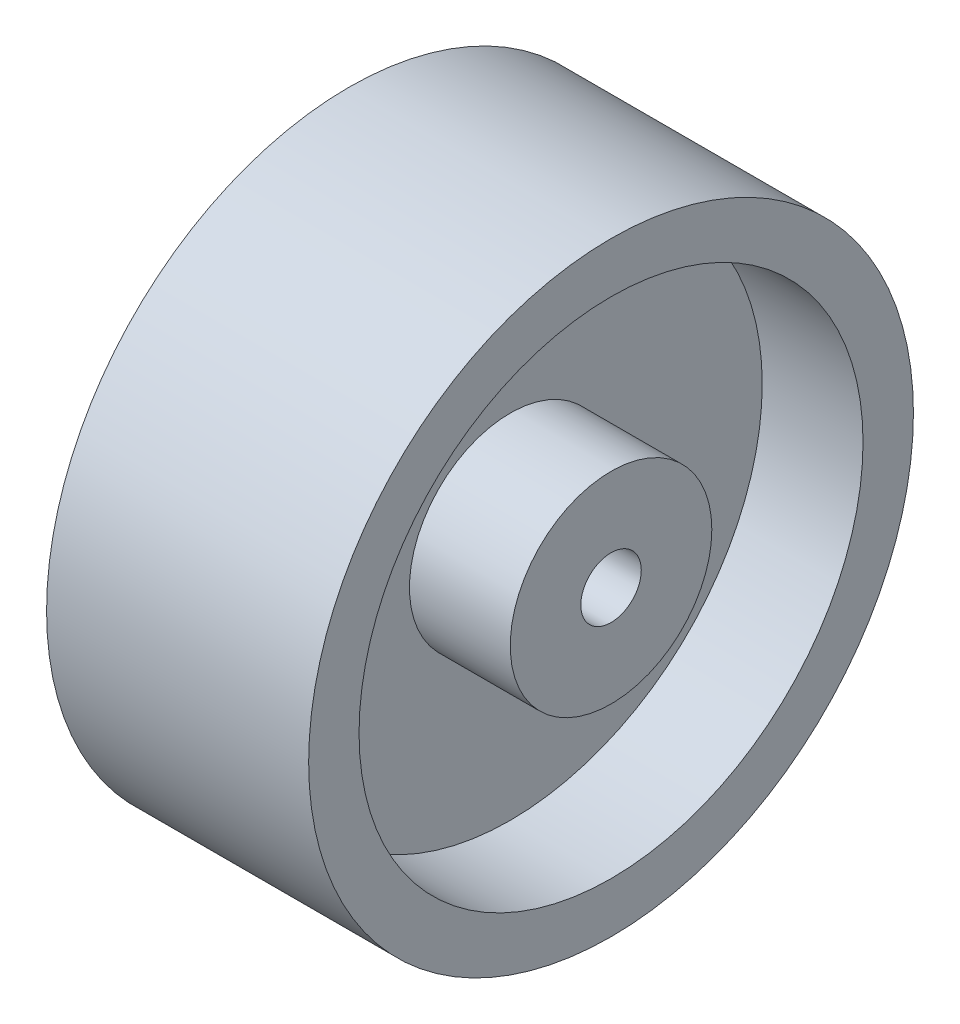
ISO-10303-21;
HEADER;
FILE_DESCRIPTION(('STEP AP214'),'2;1');
FILE_NAME('part.step','',(''),(''),'','','');
FILE_SCHEMA(('AUTOMOTIVE_DESIGN { 1 0 10303 214 1 1 1 1 }'));
ENDSEC;
DATA;
#1=APPLICATION_CONTEXT('core data for automotive mechanical design processes');
#2=APPLICATION_PROTOCOL_DEFINITION('international standard','automotive_design',2000,#1);
#3=PRODUCT_CONTEXT('',#1,'mechanical');
#4=PRODUCT('Part','Part','',(#3));
#5=PRODUCT_RELATED_PRODUCT_CATEGORY('part','',(#4));
#6=PRODUCT_DEFINITION_FORMATION('','',#4);
#7=PRODUCT_DEFINITION_CONTEXT('part definition',#1,'design');
#8=PRODUCT_DEFINITION('design','',#6,#7);
#9=PRODUCT_DEFINITION_SHAPE('','',#8);
#10=(LENGTH_UNIT() NAMED_UNIT(*) SI_UNIT(.MILLI.,.METRE.));
#11=(NAMED_UNIT(*) PLANE_ANGLE_UNIT() SI_UNIT($,.RADIAN.));
#12=(NAMED_UNIT(*) SI_UNIT($,.STERADIAN.) SOLID_ANGLE_UNIT());
#13=UNCERTAINTY_MEASURE_WITH_UNIT(LENGTH_MEASURE(1.E-05),#10,'distance_accuracy_value','');
#14=(GEOMETRIC_REPRESENTATION_CONTEXT(3) GLOBAL_UNCERTAINTY_ASSIGNED_CONTEXT((#13)) GLOBAL_UNIT_ASSIGNED_CONTEXT((#10,
#11,#12)) REPRESENTATION_CONTEXT('',''));
#15=CARTESIAN_POINT('',(0.,0.,0.));
#16=DIRECTION('',(0.,0.,1.));
#17=DIRECTION('',(1.,0.,0.));
#18=AXIS2_PLACEMENT_3D('',#15,#16,#17);
#19=CARTESIAN_POINT('',(25.,0.,0.));
#20=DIRECTION('',(-1.,0.,0.));
#21=DIRECTION('',(0.,0.,1.));
#22=AXIS2_PLACEMENT_3D('',#19,#20,#21);
#23=CYLINDRICAL_SURFACE('',#22,30.);
#24=CARTESIAN_POINT('',(25.,0.,0.));
#25=DIRECTION('',(1.,0.,0.));
#26=DIRECTION('',(0.,0.,-1.));
#27=AXIS2_PLACEMENT_3D('',#24,#25,#26);
#28=CIRCLE('',#27,30.);
#29=CARTESIAN_POINT('',(25.,0.,-30.));
#30=VERTEX_POINT('',#29);
#31=EDGE_CURVE('E12',#30,#30,#28,.T.);
#32=ORIENTED_EDGE('',*,*,#31,.F.);
#33=EDGE_LOOP('',(#32));
#34=FACE_BOUND('',#33,.T.);
#35=CARTESIAN_POINT('',(-1.,0.,0.));
#36=DIRECTION('',(-1.,0.,0.));
#37=DIRECTION('',(0.,0.,1.));
#38=AXIS2_PLACEMENT_3D('',#35,#36,#37);
#39=CIRCLE('',#38,30.);
#40=CARTESIAN_POINT('',(-1.,0.,30.));
#41=VERTEX_POINT('',#40);
#42=EDGE_CURVE('E435',#41,#41,#39,.T.);
#43=ORIENTED_EDGE('',*,*,#42,.F.);
#44=EDGE_LOOP('',(#43));
#45=FACE_BOUND('',#44,.T.);
#46=ADVANCED_FACE('F40',(#34,#45),#23,.T.);
#47=CARTESIAN_POINT('',(25.,0.,0.));
#48=DIRECTION('',(1.,0.,0.));
#49=DIRECTION('',(0.,0.,-1.));
#50=AXIS2_PLACEMENT_3D('',#47,#48,#49);
#51=PLANE('',#50);
#52=CARTESIAN_POINT('',(25.,0.,0.));
#53=DIRECTION('',(1.,0.,0.));
#54=DIRECTION('',(0.,0.,-1.));
#55=AXIS2_PLACEMENT_3D('',#52,#53,#54);
#56=CIRCLE('',#55,25.);
#57=CARTESIAN_POINT('',(25.,0.,-25.));
#58=VERTEX_POINT('',#57);
#59=EDGE_CURVE('E229',#58,#58,#56,.T.);
#60=ORIENTED_EDGE('',*,*,#59,.F.);
#61=EDGE_LOOP('',(#60));
#62=FACE_BOUND('',#61,.T.);
#63=ORIENTED_EDGE('',*,*,#31,.T.);
#64=EDGE_LOOP('',(#63));
#65=FACE_BOUND('',#64,.T.);
#66=ADVANCED_FACE('F422',(#62,#65),#51,.T.);
#67=CARTESIAN_POINT('',(15.,0.,0.));
#68=DIRECTION('',(1.,0.,0.));
#69=DIRECTION('',(0.,0.,-1.));
#70=AXIS2_PLACEMENT_3D('',#67,#68,#69);
#71=CYLINDRICAL_SURFACE('',#70,10.);
#72=CARTESIAN_POINT('',(15.,0.,0.));
#73=DIRECTION('',(1.,0.,0.));
#74=DIRECTION('',(0.,0.,-1.));
#75=AXIS2_PLACEMENT_3D('',#72,#73,#74);
#76=CIRCLE('',#75,10.);
#77=CARTESIAN_POINT('',(15.,0.,-10.));
#78=VERTEX_POINT('',#77);
#79=EDGE_CURVE('E451',#78,#78,#76,.T.);
#80=ORIENTED_EDGE('',*,*,#79,.T.);
#81=EDGE_LOOP('',(#80));
#82=FACE_BOUND('',#81,.T.);
#83=CARTESIAN_POINT('',(25.,0.,0.));
#84=DIRECTION('',(1.,0.,0.));
#85=DIRECTION('',(0.,0.,-1.));
#86=AXIS2_PLACEMENT_3D('',#83,#84,#85);
#87=CIRCLE('',#86,10.);
#88=CARTESIAN_POINT('',(25.,0.,-10.));
#89=VERTEX_POINT('',#88);
#90=EDGE_CURVE('E449',#89,#89,#87,.T.);
#91=ORIENTED_EDGE('',*,*,#90,.F.);
#92=EDGE_LOOP('',(#91));
#93=FACE_BOUND('',#92,.T.);
#94=ADVANCED_FACE('F427',(#82,#93),#71,.T.);
#95=CARTESIAN_POINT('',(15.,0.,0.));
#96=DIRECTION('',(1.,0.,0.));
#97=DIRECTION('',(0.,0.,-1.));
#98=AXIS2_PLACEMENT_3D('',#95,#96,#97);
#99=CYLINDRICAL_SURFACE('',#98,25.);
#100=CARTESIAN_POINT('',(15.,0.,0.));
#101=DIRECTION('',(1.,0.,0.));
#102=DIRECTION('',(0.,0.,-1.));
#103=AXIS2_PLACEMENT_3D('',#100,#101,#102);
#104=CIRCLE('',#103,25.);
#105=CARTESIAN_POINT('',(15.,0.,-25.));
#106=VERTEX_POINT('',#105);
#107=EDGE_CURVE('E260',#106,#106,#104,.T.);
#108=ORIENTED_EDGE('',*,*,#107,.F.);
#109=EDGE_LOOP('',(#108));
#110=FACE_BOUND('',#109,.T.);
#111=ORIENTED_EDGE('',*,*,#59,.T.);
#112=EDGE_LOOP('',(#111));
#113=FACE_BOUND('',#112,.T.);
#114=ADVANCED_FACE('F461',(#110,#113),#99,.F.);
#115=CARTESIAN_POINT('',(15.,0.,0.));
#116=DIRECTION('',(1.,0.,0.));
#117=DIRECTION('',(0.,0.,-1.));
#118=AXIS2_PLACEMENT_3D('',#115,#116,#117);
#119=PLANE('',#118);
#120=ORIENTED_EDGE('',*,*,#79,.F.);
#121=EDGE_LOOP('',(#120));
#122=FACE_BOUND('',#121,.T.);
#123=ORIENTED_EDGE('',*,*,#107,.T.);
#124=EDGE_LOOP('',(#123));
#125=FACE_BOUND('',#124,.T.);
#126=ADVANCED_FACE('F464',(#122,#125),#119,.T.);
#127=CARTESIAN_POINT('',(25.,0.,0.));
#128=DIRECTION('',(1.,0.,0.));
#129=DIRECTION('',(0.,0.,-1.));
#130=AXIS2_PLACEMENT_3D('',#127,#128,#129);
#131=CIRCLE('',#130,3.);
#132=CARTESIAN_POINT('',(25.,0.,-3.));
#133=VERTEX_POINT('',#132);
#134=EDGE_CURVE('E437',#133,#133,#131,.T.);
#135=ORIENTED_EDGE('',*,*,#134,.F.);
#136=EDGE_LOOP('',(#135));
#137=FACE_BOUND('',#136,.T.);
#138=ORIENTED_EDGE('',*,*,#90,.T.);
#139=EDGE_LOOP('',(#138));
#140=FACE_BOUND('',#139,.T.);
#141=ADVANCED_FACE('F430',(#137,#140),#51,.T.);
#142=CARTESIAN_POINT('',(15.,0.,0.));
#143=DIRECTION('',(1.,0.,0.));
#144=DIRECTION('',(0.,0.,-1.));
#145=AXIS2_PLACEMENT_3D('',#142,#143,#144);
#146=CYLINDRICAL_SURFACE('',#145,3.);
#147=CARTESIAN_POINT('',(15.,0.,0.));
#148=DIRECTION('',(1.,0.,0.));
#149=DIRECTION('',(0.,0.,-1.));
#150=AXIS2_PLACEMENT_3D('',#147,#148,#149);
#151=CIRCLE('',#150,3.);
#152=CARTESIAN_POINT('',(15.,0.,-3.));
#153=VERTEX_POINT('',#152);
#154=EDGE_CURVE('E441',#153,#153,#151,.T.);
#155=ORIENTED_EDGE('',*,*,#154,.F.);
#156=EDGE_LOOP('',(#155));
#157=FACE_BOUND('',#156,.T.);
#158=ORIENTED_EDGE('',*,*,#134,.T.);
#159=EDGE_LOOP('',(#158));
#160=FACE_BOUND('',#159,.T.);
#161=ADVANCED_FACE('F717',(#157,#160),#146,.F.);
#162=CARTESIAN_POINT('',(15.,0.,0.));
#163=DIRECTION('',(1.,0.,0.));
#164=DIRECTION('',(0.,0.,-1.));
#165=AXIS2_PLACEMENT_3D('',#162,#163,#164);
#166=PLANE('',#165);
#167=ORIENTED_EDGE('',*,*,#154,.T.);
#168=EDGE_LOOP('',(#167));
#169=FACE_BOUND('',#168,.T.);
#170=ADVANCED_FACE('F699',(#169),#166,.T.);
#171=CARTESIAN_POINT('',(-1.,0.,0.));
#172=DIRECTION('',(-1.,0.,0.));
#173=DIRECTION('',(0.,0.,1.));
#174=AXIS2_PLACEMENT_3D('',#171,#172,#173);
#175=PLANE('',#174);
#176=ORIENTED_EDGE('',*,*,#42,.T.);
#177=EDGE_LOOP('',(#176));
#178=FACE_BOUND('',#177,.T.);
#179=CARTESIAN_POINT('',(-1.,0.,0.));
#180=DIRECTION('',(-1.,0.,0.));
#181=DIRECTION('',(0.,0.,1.));
#182=AXIS2_PLACEMENT_3D('',#179,#180,#181);
#183=CIRCLE('',#182,27.0216849231796);
#184=CARTESIAN_POINT('',(-1.,0.,27.0216849231796));
#185=VERTEX_POINT('',#184);
#186=EDGE_CURVE('E438',#185,#185,#183,.T.);
#187=ORIENTED_EDGE('',*,*,#186,.F.);
#188=EDGE_LOOP('',(#187));
#189=FACE_BOUND('',#188,.T.);
#190=ADVANCED_FACE('F695',(#178,#189),#175,.T.);
#191=CARTESIAN_POINT('',(-1.,0.,0.));
#192=DIRECTION('',(1.,0.,0.));
#193=DIRECTION('',(0.,0.,-1.));
#194=AXIS2_PLACEMENT_3D('',#191,#192,#193);
#195=CYLINDRICAL_SURFACE('',#194,27.0216849231796);
#196=ORIENTED_EDGE('',*,*,#186,.T.);
#197=EDGE_LOOP('',(#196));
#198=FACE_BOUND('',#197,.T.);
#199=CARTESIAN_POINT('',(0.,0.,0.));
#200=DIRECTION('',(-1.,0.,0.));
#201=DIRECTION('',(0.,0.,1.));
#202=AXIS2_PLACEMENT_3D('',#199,#200,#201);
#203=CIRCLE('',#202,27.0216849231796);
#204=CARTESIAN_POINT('',(0.,0.,27.0216849231796));
#205=VERTEX_POINT('',#204);
#206=EDGE_CURVE('E444',#205,#205,#203,.T.);
#207=ORIENTED_EDGE('',*,*,#206,.F.);
#208=EDGE_LOOP('',(#207));
#209=FACE_BOUND('',#208,.T.);
#210=ADVANCED_FACE('F519',(#198,#209),#195,.F.);
#211=CARTESIAN_POINT('',(5.,-1.50568088735943,0.));
#212=DIRECTION('',(-1.,0.,0.));
#213=DIRECTION('',(0.,0.,-1.));
#214=AXIS2_PLACEMENT_3D('',#211,#212,#213);
#215=PLANE('',#214);
#216=CARTESIAN_POINT('',(5.,-1.50568088735943,0.));
#217=DIRECTION('',(-1.,0.,0.));
#218=DIRECTION('',(0.,0.,-1.));
#219=AXIS2_PLACEMENT_3D('',#216,#217,#218);
#220=CIRCLE('',#219,25.);
#221=CARTESIAN_POINT('',(5.,-26.1809219706033,-4.01652554875415));
#222=VERTEX_POINT('',#221);
#223=CARTESIAN_POINT('',(5.,-26.1809219706033,4.01652554875413));
#224=VERTEX_POINT('',#223);
#225=EDGE_CURVE('E275',#222,#224,#220,.T.);
#226=ORIENTED_EDGE('',*,*,#225,.T.);
#227=DIRECTION('',(0.,0.996747120219004,-0.0805926692393482));
#228=VECTOR('',#227,1.);
#229=CARTESIAN_POINT('',(5.,-1.34330142898136,2.00826277437705));
#230=LINE('',#229,#228);
#231=CARTESIAN_POINT('',(5.,-5.90449657616299,2.37706132355386));
#232=VERTEX_POINT('',#231);
#233=EDGE_CURVE('E278',#224,#232,#230,.T.);
#234=ORIENTED_EDGE('',*,*,#233,.T.);
#235=CARTESIAN_POINT('',(5.,-1.50568088735943,0.));
#236=DIRECTION('',(-1.,0.,0.));
#237=DIRECTION('',(0.,0.,-1.));
#238=AXIS2_PLACEMENT_3D('',#235,#236,#237);
#239=CIRCLE('',#238,5.);
#240=CARTESIAN_POINT('',(5.,-5.90449657616299,-2.37706132355388));
#241=VERTEX_POINT('',#240);
#242=EDGE_CURVE('E282',#241,#232,#239,.T.);
#243=ORIENTED_EDGE('',*,*,#242,.F.);
#244=DIRECTION('',(0.,0.996747120219004,0.0805926692393482));
#245=VECTOR('',#244,1.);
#246=CARTESIAN_POINT('',(5.,-1.34330142898136,-2.00826277437707));
#247=LINE('',#246,#245);
#248=EDGE_CURVE('E284',#222,#241,#247,.T.);
#249=ORIENTED_EDGE('',*,*,#248,.F.);
#250=EDGE_LOOP('',(#226,#234,#243,#249));
#251=FACE_BOUND('',#250,.T.);
#252=ADVANCED_FACE('F516',(#251),#215,.T.);
#253=CARTESIAN_POINT('',(5.,-1.12926066551957,-0.651978949222987));
#254=DIRECTION('',(-1.,0.,0.));
#255=DIRECTION('',(0.,0.866025403784436,-0.500000000000004));
#256=AXIS2_PLACEMENT_3D('',#253,#254,#255);
#257=PLANE('',#256);
#258=CARTESIAN_POINT('',(5.,-1.12926066551957,-0.651978949222987));
#259=DIRECTION('',(-1.,0.,0.));
#260=DIRECTION('',(0.,0.866025403784436,-0.500000000000004));
#261=AXIS2_PLACEMENT_3D('',#258,#259,#260);
#262=CIRCLE('',#261,25.);
#263=CARTESIAN_POINT('',(5.,-9.98846804697129,-24.0296273461947));
#264=VERTEX_POINT('',#263);
#265=CARTESIAN_POINT('',(5.,-16.9452943673119,-20.0131017974405));
#266=VERTEX_POINT('',#265);
#267=EDGE_CURVE('E303',#264,#266,#262,.T.);
#268=ORIENTED_EDGE('',*,*,#267,.T.);
#269=DIRECTION('',(0.,0.568168859029578,0.822911992638963));
#270=VECTOR('',#269,1.);
#271=CARTESIAN_POINT('',(5.,-2.78727751641568,0.492777173973722));
#272=LINE('',#271,#270);
#273=CARTESIAN_POINT('',(5.,-5.38726400247248,-3.27293442051546));
#274=VERTEX_POINT('',#273);
#275=EDGE_CURVE('E306',#266,#274,#272,.T.);
#276=ORIENTED_EDGE('',*,*,#275,.T.);
#277=CARTESIAN_POINT('',(5.,-1.12926066551957,-0.651978949222987));
#278=DIRECTION('',(-1.,0.,0.));
#279=DIRECTION('',(0.,0.866025403784436,-0.500000000000004));
#280=AXIS2_PLACEMENT_3D('',#277,#278,#279);
#281=CIRCLE('',#280,5.);
#282=CARTESIAN_POINT('',(5.,-1.27007301737026,-5.64999574406935));
#283=VERTEX_POINT('',#282);
#284=EDGE_CURVE('E310',#283,#274,#281,.T.);
#285=ORIENTED_EDGE('',*,*,#284,.F.);
#286=DIRECTION('',(0.,0.428578261189434,0.903504661878311));
#287=VECTOR('',#286,1.);
#288=CARTESIAN_POINT('',(5.,0.691135643754615,-1.51548560040336));
#289=LINE('',#288,#287);
#290=EDGE_CURVE('E312',#264,#283,#289,.T.);
#291=ORIENTED_EDGE('',*,*,#290,.F.);
#292=EDGE_LOOP('',(#268,#276,#285,#291));
#293=FACE_BOUND('',#292,.T.);
#294=ADVANCED_FACE('F481',(#293),#257,.T.);
#295=CARTESIAN_POINT('',(5.,-1.12926066551957,0.651978949222977));
#296=DIRECTION('',(-1.,0.,0.));
#297=DIRECTION('',(0.,-0.866025403784443,-0.499999999999992));
#298=AXIS2_PLACEMENT_3D('',#295,#296,#297);
#299=PLANE('',#298);
#300=CARTESIAN_POINT('',(5.,-1.12926066551957,0.651978949222977));
#301=DIRECTION('',(-1.,0.,0.));
#302=DIRECTION('',(0.,-0.866025403784443,-0.499999999999992));
#303=AXIS2_PLACEMENT_3D('',#300,#301,#302);
#304=CIRCLE('',#303,25.);
#305=CARTESIAN_POINT('',(5.,-16.9452943673116,20.0131017974407));
#306=VERTEX_POINT('',#305);
#307=CARTESIAN_POINT('',(5.,-9.98846804697097,24.0296273461948));
#308=VERTEX_POINT('',#307);
#309=EDGE_CURVE('E204',#306,#308,#304,.T.);
#310=ORIENTED_EDGE('',*,*,#309,.T.);
#311=DIRECTION('',(0.,0.428578261189421,-0.903504661878317));
#312=VECTOR('',#311,1.);
#313=CARTESIAN_POINT('',(5.,0.691135643754627,1.51548560040332));
#314=LINE('',#313,#312);
#315=CARTESIAN_POINT('',(5.,-1.27007301737019,5.64999574406934));
#316=VERTEX_POINT('',#315);
#317=EDGE_CURVE('E215',#308,#316,#314,.T.);
#318=ORIENTED_EDGE('',*,*,#317,.T.);
#319=CARTESIAN_POINT('',(5.,-1.12926066551957,0.651978949222977));
#320=DIRECTION('',(-1.,0.,0.));
#321=DIRECTION('',(0.,-0.866025403784443,-0.499999999999992));
#322=AXIS2_PLACEMENT_3D('',#319,#320,#321);
#323=CIRCLE('',#322,5.);
#324=CARTESIAN_POINT('',(5.,-5.38726400247244,3.27293442051551));
#325=VERTEX_POINT('',#324);
#326=EDGE_CURVE('E219',#325,#316,#323,.T.);
#327=ORIENTED_EDGE('',*,*,#326,.F.);
#328=DIRECTION('',(0.,0.568168859029566,-0.82291199263897));
#329=VECTOR('',#328,1.);
#330=CARTESIAN_POINT('',(5.,-2.7872775164157,-0.492777173973709));
#331=LINE('',#330,#329);
#332=EDGE_CURVE('E211',#306,#325,#331,.T.);
#333=ORIENTED_EDGE('',*,*,#332,.F.);
#334=EDGE_LOOP('',(#310,#318,#327,#333));
#335=FACE_BOUND('',#334,.T.);
#336=ADVANCED_FACE('F222',(#335),#299,.T.);
#337=CARTESIAN_POINT('',(5.,-0.376420221839854,0.651978949222974));
#338=DIRECTION('',(-1.,0.,0.));
#339=DIRECTION('',(0.,-0.866025403784433,0.50000000000001));
#340=AXIS2_PLACEMENT_3D('',#337,#338,#339);
#341=PLANE('',#340);
#342=CARTESIAN_POINT('',(5.,-0.376420221839854,0.651978949222974));
#343=DIRECTION('',(-1.,0.,0.));
#344=DIRECTION('',(0.,-0.866025403784433,0.50000000000001));
#345=AXIS2_PLACEMENT_3D('',#342,#343,#344);
#346=CIRCLE('',#345,25.);
#347=CARTESIAN_POINT('',(5.,8.48278715961203,24.0296273461946));
#348=VERTEX_POINT('',#347);
#349=CARTESIAN_POINT('',(5.,15.4396134799526,20.0131017974403));
#350=VERTEX_POINT('',#349);
#351=EDGE_CURVE('E245',#348,#350,#346,.T.);
#352=ORIENTED_EDGE('',*,*,#351,.T.);
#353=DIRECTION('',(0.,-0.568168859029584,-0.822911992638958));
#354=VECTOR('',#353,1.);
#355=CARTESIAN_POINT('',(5.,1.28159662905625,-0.492777173973746));
#356=LINE('',#355,#354);
#357=CARTESIAN_POINT('',(5.,3.88158311511307,3.27293442051541));
#358=VERTEX_POINT('',#357);
#359=EDGE_CURVE('E248',#350,#358,#356,.T.);
#360=ORIENTED_EDGE('',*,*,#359,.T.);
#361=CARTESIAN_POINT('',(5.,-0.376420221839854,0.651978949222974));
#362=DIRECTION('',(-1.,0.,0.));
#363=DIRECTION('',(0.,-0.866025403784433,0.50000000000001));
#364=AXIS2_PLACEMENT_3D('',#361,#362,#363);
#365=CIRCLE('',#364,5.);
#366=CARTESIAN_POINT('',(5.,-0.23560786998913,5.64999574406933));
#367=VERTEX_POINT('',#366);
#368=EDGE_CURVE('E252',#367,#358,#365,.T.);
#369=ORIENTED_EDGE('',*,*,#368,.F.);
#370=DIRECTION('',(0.,-0.42857826118944,-0.903504661878308));
#371=VECTOR('',#370,1.);
#372=CARTESIAN_POINT('',(5.,-2.19681653111403,1.51548560040336));
#373=LINE('',#372,#371);
#374=EDGE_CURVE('E254',#348,#367,#373,.T.);
#375=ORIENTED_EDGE('',*,*,#374,.F.);
#376=EDGE_LOOP('',(#352,#360,#369,#375));
#377=FACE_BOUND('',#376,.T.);
#378=ADVANCED_FACE('F480',(#377),#341,.T.);
#379=CARTESIAN_POINT('',(5.,-0.376420221839855,-0.651978949222984));
#380=DIRECTION('',(-1.,0.,0.));
#381=DIRECTION('',(0.,0.86602540378444,0.499999999999998));
#382=AXIS2_PLACEMENT_3D('',#379,#380,#381);
#383=PLANE('',#382);
#384=CARTESIAN_POINT('',(5.,-0.376420221839855,-0.651978949222984));
#385=DIRECTION('',(-1.,0.,0.));
#386=DIRECTION('',(0.,0.86602540378444,0.499999999999998));
#387=AXIS2_PLACEMENT_3D('',#384,#385,#386);
#388=CIRCLE('',#387,25.);
#389=CARTESIAN_POINT('',(5.,15.4396134799523,-20.0131017974406));
#390=VERTEX_POINT('',#389);
#391=CARTESIAN_POINT('',(5.,8.4827871596117,-24.0296273461947));
#392=VERTEX_POINT('',#391);
#393=EDGE_CURVE('E332',#390,#392,#388,.T.);
#394=ORIENTED_EDGE('',*,*,#393,.T.);
#395=DIRECTION('',(0.,-0.428578261189428,0.903504661878314));
#396=VECTOR('',#395,1.);
#397=CARTESIAN_POINT('',(5.,-2.19681653111405,-1.51548560040334));
#398=LINE('',#397,#396);
#399=CARTESIAN_POINT('',(5.,-0.2356078699892,-5.64999574406934));
#400=VERTEX_POINT('',#399);
#401=EDGE_CURVE('E335',#392,#400,#398,.T.);
#402=ORIENTED_EDGE('',*,*,#401,.T.);
#403=CARTESIAN_POINT('',(5.,-0.376420221839855,-0.651978949222984));
#404=DIRECTION('',(-1.,0.,0.));
#405=DIRECTION('',(0.,0.86602540378444,0.499999999999998));
#406=AXIS2_PLACEMENT_3D('',#403,#404,#405);
#407=CIRCLE('',#406,5.);
#408=CARTESIAN_POINT('',(5.,3.88158311511303,-3.27293442051548));
#409=VERTEX_POINT('',#408);
#410=EDGE_CURVE('E339',#409,#400,#407,.T.);
#411=ORIENTED_EDGE('',*,*,#410,.F.);
#412=DIRECTION('',(0.,-0.568168859029572,0.822911992638966));
#413=VECTOR('',#412,1.);
#414=CARTESIAN_POINT('',(5.,1.28159662905626,0.492777173973713));
#415=LINE('',#414,#413);
#416=EDGE_CURVE('E341',#390,#409,#415,.T.);
#417=ORIENTED_EDGE('',*,*,#416,.F.);
#418=EDGE_LOOP('',(#394,#402,#411,#417));
#419=FACE_BOUND('',#418,.T.);
#420=ADVANCED_FACE('F498',(#419),#383,.T.);
#421=CARTESIAN_POINT('',(5.,0.,0.));
#422=DIRECTION('',(-1.,0.,0.));
#423=DIRECTION('',(0.,0.,1.));
#424=AXIS2_PLACEMENT_3D('',#421,#422,#423);
#425=PLANE('',#424);
#426=CARTESIAN_POINT('',(5.,0.,0.));
#427=DIRECTION('',(-1.,0.,0.));
#428=DIRECTION('',(0.,0.,1.));
#429=AXIS2_PLACEMENT_3D('',#426,#427,#428);
#430=CIRCLE('',#429,25.);
#431=CARTESIAN_POINT('',(5.,24.6752410832439,4.01652554875414));
#432=VERTEX_POINT('',#431);
#433=CARTESIAN_POINT('',(5.,24.6752410832439,-4.01652554875414));
#434=VERTEX_POINT('',#433);
#435=EDGE_CURVE('E362',#432,#434,#430,.T.);
#436=ORIENTED_EDGE('',*,*,#435,.T.);
#437=DIRECTION('',(0.,-0.996747120219004,0.0805926692393482));
#438=VECTOR('',#437,1.);
#439=CARTESIAN_POINT('',(5.,-0.162379458378074,-2.00826277437706));
#440=LINE('',#439,#438);
#441=CARTESIAN_POINT('',(5.,4.39881568880356,-2.37706132355387));
#442=VERTEX_POINT('',#441);
#443=EDGE_CURVE('E365',#434,#442,#440,.T.);
#444=ORIENTED_EDGE('',*,*,#443,.T.);
#445=CARTESIAN_POINT('',(5.,0.,0.));
#446=DIRECTION('',(-1.,0.,0.));
#447=DIRECTION('',(0.,0.,1.));
#448=AXIS2_PLACEMENT_3D('',#445,#446,#447);
#449=CIRCLE('',#448,5.);
#450=CARTESIAN_POINT('',(5.,4.39881568880356,2.37706132355387));
#451=VERTEX_POINT('',#450);
#452=EDGE_CURVE('E369',#451,#442,#449,.T.);
#453=ORIENTED_EDGE('',*,*,#452,.F.);
#454=DIRECTION('',(0.,-0.996747120219004,-0.0805926692393482));
#455=VECTOR('',#454,1.);
#456=CARTESIAN_POINT('',(5.,-0.162379458378074,2.00826277437706));
#457=LINE('',#456,#455);
#458=EDGE_CURVE('E371',#432,#451,#457,.T.);
#459=ORIENTED_EDGE('',*,*,#458,.F.);
#460=EDGE_LOOP('',(#436,#444,#453,#459));
#461=FACE_BOUND('',#460,.T.);
#462=ADVANCED_FACE('F406',(#461),#425,.T.);
#463=CARTESIAN_POINT('',(5.,-1.50568088735943,0.));
#464=DIRECTION('',(-1.,0.,0.));
#465=DIRECTION('',(0.,0.,1.));
#466=AXIS2_PLACEMENT_3D('',#463,#464,#465);
#467=CYLINDRICAL_SURFACE('',#466,5.);
#468=CARTESIAN_POINT('',(0.,-1.50568088735943,0.));
#469=DIRECTION('',(-1.,0.,0.));
#470=DIRECTION('',(0.,0.,-1.));
#471=AXIS2_PLACEMENT_3D('',#468,#469,#470);
#472=CIRCLE('',#471,5.);
#473=CARTESIAN_POINT('',(0.,-5.90449657616299,-2.37706132355388));
#474=VERTEX_POINT('',#473);
#475=CARTESIAN_POINT('',(0.,-5.90449657616299,2.37706132355386));
#476=VERTEX_POINT('',#475);
#477=EDGE_CURVE('E291',#474,#476,#472,.T.);
#478=ORIENTED_EDGE('',*,*,#477,.F.);
#479=DIRECTION('',(-1.,0.,0.));
#480=VECTOR('',#479,1.);
#481=CARTESIAN_POINT('',(5.,-5.90449657616299,-2.37706132355388));
#482=LINE('',#481,#480);
#483=EDGE_CURVE('E298',#241,#474,#482,.T.);
#484=ORIENTED_EDGE('',*,*,#483,.F.);
#485=ORIENTED_EDGE('',*,*,#242,.T.);
#486=DIRECTION('',(-1.,0.,0.));
#487=VECTOR('',#486,1.);
#488=CARTESIAN_POINT('',(5.,-5.90449657616299,2.37706132355386));
#489=LINE('',#488,#487);
#490=EDGE_CURVE('E300',#232,#476,#489,.T.);
#491=ORIENTED_EDGE('',*,*,#490,.T.);
#492=EDGE_LOOP('',(#478,#484,#485,#491));
#493=FACE_BOUND('',#492,.T.);
#494=ADVANCED_FACE('F525',(#493),#467,.T.);
#495=CARTESIAN_POINT('',(5.,-1.34330142898136,-2.00826277437707));
#496=DIRECTION('',(0.,-0.0805926692393482,0.996747120219004));
#497=DIRECTION('',(0.,-0.996747120219004,-0.0805926692393482));
#498=AXIS2_PLACEMENT_3D('',#495,#496,#497);
#499=PLANE('',#498);
#500=DIRECTION('',(0.,0.996747120219004,0.0805926692393482));
#501=VECTOR('',#500,1.);
#502=CARTESIAN_POINT('',(0.,-1.34330142898136,-2.00826277437707));
#503=LINE('',#502,#501);
#504=CARTESIAN_POINT('',(0.,-26.1809219706033,-4.01652554875415));
#505=VERTEX_POINT('',#504);
#506=EDGE_CURVE('E279',#505,#474,#503,.T.);
#507=ORIENTED_EDGE('',*,*,#506,.F.);
#508=DIRECTION('',(-1.,0.,0.));
#509=VECTOR('',#508,1.);
#510=CARTESIAN_POINT('',(5.,-26.1809219706033,-4.01652554875415));
#511=LINE('',#510,#509);
#512=EDGE_CURVE('E296',#222,#505,#511,.T.);
#513=ORIENTED_EDGE('',*,*,#512,.F.);
#514=ORIENTED_EDGE('',*,*,#248,.T.);
#515=ORIENTED_EDGE('',*,*,#483,.T.);
#516=EDGE_LOOP('',(#507,#513,#514,#515));
#517=FACE_BOUND('',#516,.T.);
#518=ADVANCED_FACE('F521',(#517),#499,.T.);
#519=CARTESIAN_POINT('',(5.,-1.50568088735943,0.));
#520=DIRECTION('',(-1.,0.,0.));
#521=DIRECTION('',(0.,0.,1.));
#522=AXIS2_PLACEMENT_3D('',#519,#520,#521);
#523=CYLINDRICAL_SURFACE('',#522,25.);
#524=CARTESIAN_POINT('',(0.,-1.50568088735943,0.));
#525=DIRECTION('',(-1.,0.,0.));
#526=DIRECTION('',(0.,0.,-1.));
#527=AXIS2_PLACEMENT_3D('',#524,#525,#526);
#528=CIRCLE('',#527,25.);
#529=CARTESIAN_POINT('',(0.,-26.1809219706033,4.01652554875413));
#530=VERTEX_POINT('',#529);
#531=EDGE_CURVE('E54',#505,#530,#528,.T.);
#532=ORIENTED_EDGE('',*,*,#531,.T.);
#533=DIRECTION('',(-1.,0.,0.));
#534=VECTOR('',#533,1.);
#535=CARTESIAN_POINT('',(5.,-26.1809219706033,4.01652554875413));
#536=LINE('',#535,#534);
#537=EDGE_CURVE('E286',#224,#530,#536,.T.);
#538=ORIENTED_EDGE('',*,*,#537,.F.);
#539=ORIENTED_EDGE('',*,*,#225,.F.);
#540=ORIENTED_EDGE('',*,*,#512,.T.);
#541=EDGE_LOOP('',(#532,#538,#539,#540));
#542=FACE_BOUND('',#541,.T.);
#543=ADVANCED_FACE('F524',(#542),#523,.F.);
#544=CARTESIAN_POINT('',(5.,-1.34330142898136,2.00826277437705));
#545=DIRECTION('',(0.,0.0805926692393482,0.996747120219004));
#546=DIRECTION('',(0.,-0.996747120219004,0.0805926692393482));
#547=AXIS2_PLACEMENT_3D('',#544,#545,#546);
#548=PLANE('',#547);
#549=DIRECTION('',(0.,0.996747120219004,-0.0805926692393482));
#550=VECTOR('',#549,1.);
#551=CARTESIAN_POINT('',(0.,-1.34330142898136,2.00826277437705));
#552=LINE('',#551,#550);
#553=EDGE_CURVE('E288',#530,#476,#552,.T.);
#554=ORIENTED_EDGE('',*,*,#553,.T.);
#555=ORIENTED_EDGE('',*,*,#490,.F.);
#556=ORIENTED_EDGE('',*,*,#233,.F.);
#557=ORIENTED_EDGE('',*,*,#537,.T.);
#558=EDGE_LOOP('',(#554,#555,#556,#557));
#559=FACE_BOUND('',#558,.T.);
#560=ADVANCED_FACE('F530',(#559),#548,.F.);
#561=CARTESIAN_POINT('',(5.,-1.12926066551957,-0.651978949222987));
#562=DIRECTION('',(-1.,0.,0.));
#563=DIRECTION('',(0.,0.,1.));
#564=AXIS2_PLACEMENT_3D('',#561,#562,#563);
#565=CYLINDRICAL_SURFACE('',#564,5.);
#566=CARTESIAN_POINT('',(0.,-1.12926066551957,-0.651978949222987));
#567=DIRECTION('',(-1.,0.,0.));
#568=DIRECTION('',(0.,0.866025403784436,-0.500000000000004));
#569=AXIS2_PLACEMENT_3D('',#566,#567,#568);
#570=CIRCLE('',#569,5.);
#571=CARTESIAN_POINT('',(0.,-1.27007301737026,-5.64999574406935));
#572=VERTEX_POINT('',#571);
#573=CARTESIAN_POINT('',(0.,-5.38726400247248,-3.27293442051546));
#574=VERTEX_POINT('',#573);
#575=EDGE_CURVE('E319',#572,#574,#570,.T.);
#576=ORIENTED_EDGE('',*,*,#575,.F.);
#577=DIRECTION('',(-1.,0.,0.));
#578=VECTOR('',#577,1.);
#579=CARTESIAN_POINT('',(5.,-1.27007301737026,-5.64999574406935));
#580=LINE('',#579,#578);
#581=EDGE_CURVE('E327',#283,#572,#580,.T.);
#582=ORIENTED_EDGE('',*,*,#581,.F.);
#583=ORIENTED_EDGE('',*,*,#284,.T.);
#584=DIRECTION('',(-1.,0.,0.));
#585=VECTOR('',#584,1.);
#586=CARTESIAN_POINT('',(5.,-5.38726400247248,-3.27293442051546));
#587=LINE('',#586,#585);
#588=EDGE_CURVE('E329',#274,#574,#587,.T.);
#589=ORIENTED_EDGE('',*,*,#588,.T.);
#590=EDGE_LOOP('',(#576,#582,#583,#589));
#591=FACE_BOUND('',#590,.T.);
#592=ADVANCED_FACE('F533',(#591),#565,.T.);
#593=CARTESIAN_POINT('',(5.,0.691135643754615,-1.51548560040336));
#594=DIRECTION('',(0.,-0.903504661878311,0.428578261189434));
#595=DIRECTION('',(0.,-0.428578261189434,-0.903504661878311));
#596=AXIS2_PLACEMENT_3D('',#593,#594,#595);
#597=PLANE('',#596);
#598=DIRECTION('',(0.,0.428578261189434,0.903504661878311));
#599=VECTOR('',#598,1.);
#600=CARTESIAN_POINT('',(0.,0.691135643754615,-1.51548560040336));
#601=LINE('',#600,#599);
#602=CARTESIAN_POINT('',(0.,-9.98846804697129,-24.0296273461947));
#603=VERTEX_POINT('',#602);
#604=EDGE_CURVE('E307',#603,#572,#601,.T.);
#605=ORIENTED_EDGE('',*,*,#604,.F.);
#606=DIRECTION('',(-1.,0.,0.));
#607=VECTOR('',#606,1.);
#608=CARTESIAN_POINT('',(5.,-9.98846804697129,-24.0296273461947));
#609=LINE('',#608,#607);
#610=EDGE_CURVE('E324',#264,#603,#609,.T.);
#611=ORIENTED_EDGE('',*,*,#610,.F.);
#612=ORIENTED_EDGE('',*,*,#290,.T.);
#613=ORIENTED_EDGE('',*,*,#581,.T.);
#614=EDGE_LOOP('',(#605,#611,#612,#613));
#615=FACE_BOUND('',#614,.T.);
#616=ADVANCED_FACE('F540',(#615),#597,.T.);
#617=CARTESIAN_POINT('',(5.,-1.12926066551957,-0.651978949222987));
#618=DIRECTION('',(-1.,0.,0.));
#619=DIRECTION('',(0.,0.,1.));
#620=AXIS2_PLACEMENT_3D('',#617,#618,#619);
#621=CYLINDRICAL_SURFACE('',#620,25.);
#622=CARTESIAN_POINT('',(0.,-1.12926066551957,-0.651978949222987));
#623=DIRECTION('',(-1.,0.,0.));
#624=DIRECTION('',(0.,0.866025403784436,-0.500000000000004));
#625=AXIS2_PLACEMENT_3D('',#622,#623,#624);
#626=CIRCLE('',#625,25.);
#627=CARTESIAN_POINT('',(0.,-16.9452943673119,-20.0131017974405));
#628=VERTEX_POINT('',#627);
#629=EDGE_CURVE('E62',#603,#628,#626,.T.);
#630=ORIENTED_EDGE('',*,*,#629,.T.);
#631=DIRECTION('',(-1.,0.,0.));
#632=VECTOR('',#631,1.);
#633=CARTESIAN_POINT('',(5.,-16.9452943673119,-20.0131017974405));
#634=LINE('',#633,#632);
#635=EDGE_CURVE('E314',#266,#628,#634,.T.);
#636=ORIENTED_EDGE('',*,*,#635,.F.);
#637=ORIENTED_EDGE('',*,*,#267,.F.);
#638=ORIENTED_EDGE('',*,*,#610,.T.);
#639=EDGE_LOOP('',(#630,#636,#637,#638));
#640=FACE_BOUND('',#639,.T.);
#641=ADVANCED_FACE('F543',(#640),#621,.F.);
#642=CARTESIAN_POINT('',(5.,-2.78727751641568,0.492777173973722));
#643=DIRECTION('',(0.,-0.822911992638962,0.568168859029578));
#644=DIRECTION('',(0.,-0.568168859029578,-0.822911992638962));
#645=AXIS2_PLACEMENT_3D('',#642,#643,#644);
#646=PLANE('',#645);
#647=DIRECTION('',(0.,0.568168859029578,0.822911992638963));
#648=VECTOR('',#647,1.);
#649=CARTESIAN_POINT('',(0.,-2.78727751641568,0.492777173973722));
#650=LINE('',#649,#648);
#651=EDGE_CURVE('E316',#628,#574,#650,.T.);
#652=ORIENTED_EDGE('',*,*,#651,.T.);
#653=ORIENTED_EDGE('',*,*,#588,.F.);
#654=ORIENTED_EDGE('',*,*,#275,.F.);
#655=ORIENTED_EDGE('',*,*,#635,.T.);
#656=EDGE_LOOP('',(#652,#653,#654,#655));
#657=FACE_BOUND('',#656,.T.);
#658=ADVANCED_FACE('F489',(#657),#646,.F.);
#659=CARTESIAN_POINT('',(5.,-1.12926066551957,0.651978949222977));
#660=DIRECTION('',(-1.,0.,0.));
#661=DIRECTION('',(0.,0.,1.));
#662=AXIS2_PLACEMENT_3D('',#659,#660,#661);
#663=CYLINDRICAL_SURFACE('',#662,5.);
#664=CARTESIAN_POINT('',(0.,-1.12926066551957,0.651978949222977));
#665=DIRECTION('',(-1.,0.,0.));
#666=DIRECTION('',(0.,-0.866025403784443,-0.499999999999992));
#667=AXIS2_PLACEMENT_3D('',#664,#665,#666);
#668=CIRCLE('',#667,5.);
#669=CARTESIAN_POINT('',(0.,-5.38726400247244,3.27293442051551));
#670=VERTEX_POINT('',#669);
#671=CARTESIAN_POINT('',(0.,-1.27007301737019,5.64999574406934));
#672=VERTEX_POINT('',#671);
#673=EDGE_CURVE('E226',#670,#672,#668,.T.);
#674=ORIENTED_EDGE('',*,*,#673,.F.);
#675=DIRECTION('',(-1.,0.,0.));
#676=VECTOR('',#675,1.);
#677=CARTESIAN_POINT('',(5.,-5.38726400247244,3.27293442051551));
#678=LINE('',#677,#676);
#679=EDGE_CURVE('E242',#325,#670,#678,.T.);
#680=ORIENTED_EDGE('',*,*,#679,.F.);
#681=ORIENTED_EDGE('',*,*,#326,.T.);
#682=DIRECTION('',(-1.,0.,0.));
#683=VECTOR('',#682,1.);
#684=CARTESIAN_POINT('',(5.,-1.27007301737019,5.64999574406934));
#685=LINE('',#684,#683);
#686=EDGE_CURVE('E210',#316,#672,#685,.T.);
#687=ORIENTED_EDGE('',*,*,#686,.T.);
#688=EDGE_LOOP('',(#674,#680,#681,#687));
#689=FACE_BOUND('',#688,.T.);
#690=ADVANCED_FACE('F485',(#689),#663,.T.);
#691=CARTESIAN_POINT('',(5.,-2.7872775164157,-0.492777173973709));
#692=DIRECTION('',(0.,0.82291199263897,0.568168859029566));
#693=DIRECTION('',(0.,-0.568168859029566,0.82291199263897));
#694=AXIS2_PLACEMENT_3D('',#691,#692,#693);
#695=PLANE('',#694);
#696=DIRECTION('',(0.,0.568168859029566,-0.82291199263897));
#697=VECTOR('',#696,1.);
#698=CARTESIAN_POINT('',(0.,-2.7872775164157,-0.492777173973709));
#699=LINE('',#698,#697);
#700=CARTESIAN_POINT('',(0.,-16.9452943673116,20.0131017974407));
#701=VERTEX_POINT('',#700);
#702=EDGE_CURVE('E223',#701,#670,#699,.T.);
#703=ORIENTED_EDGE('',*,*,#702,.F.);
#704=DIRECTION('',(-1.,0.,0.));
#705=VECTOR('',#704,1.);
#706=CARTESIAN_POINT('',(5.,-16.9452943673116,20.0131017974407));
#707=LINE('',#706,#705);
#708=EDGE_CURVE('E240',#306,#701,#707,.T.);
#709=ORIENTED_EDGE('',*,*,#708,.F.);
#710=ORIENTED_EDGE('',*,*,#332,.T.);
#711=ORIENTED_EDGE('',*,*,#679,.T.);
#712=EDGE_LOOP('',(#703,#709,#710,#711));
#713=FACE_BOUND('',#712,.T.);
#714=ADVANCED_FACE('F482',(#713),#695,.T.);
#715=CARTESIAN_POINT('',(5.,-1.12926066551957,0.651978949222977));
#716=DIRECTION('',(-1.,0.,0.));
#717=DIRECTION('',(0.,0.,1.));
#718=AXIS2_PLACEMENT_3D('',#715,#716,#717);
#719=CYLINDRICAL_SURFACE('',#718,25.);
#720=CARTESIAN_POINT('',(0.,-1.12926066551957,0.651978949222977));
#721=DIRECTION('',(-1.,0.,0.));
#722=DIRECTION('',(0.,-0.866025403784443,-0.499999999999992));
#723=AXIS2_PLACEMENT_3D('',#720,#721,#722);
#724=CIRCLE('',#723,25.);
#725=CARTESIAN_POINT('',(0.,-9.98846804697096,24.0296273461948));
#726=VERTEX_POINT('',#725);
#727=EDGE_CURVE('E206',#701,#726,#724,.T.);
#728=ORIENTED_EDGE('',*,*,#727,.T.);
#729=DIRECTION('',(-1.,0.,0.));
#730=VECTOR('',#729,1.);
#731=CARTESIAN_POINT('',(5.,-9.98846804697097,24.0296273461948));
#732=LINE('',#731,#730);
#733=EDGE_CURVE('E200',#308,#726,#732,.T.);
#734=ORIENTED_EDGE('',*,*,#733,.F.);
#735=ORIENTED_EDGE('',*,*,#309,.F.);
#736=ORIENTED_EDGE('',*,*,#708,.T.);
#737=EDGE_LOOP('',(#728,#734,#735,#736));
#738=FACE_BOUND('',#737,.T.);
#739=ADVANCED_FACE('F202',(#738),#719,.F.);
#740=CARTESIAN_POINT('',(5.,0.691135643754627,1.51548560040332));
#741=DIRECTION('',(0.,0.903504661878317,0.428578261189421));
#742=DIRECTION('',(0.,-0.428578261189421,0.903504661878317));
#743=AXIS2_PLACEMENT_3D('',#740,#741,#742);
#744=PLANE('',#743);
#745=DIRECTION('',(0.,0.428578261189421,-0.903504661878317));
#746=VECTOR('',#745,1.);
#747=CARTESIAN_POINT('',(0.,0.691135643754627,1.51548560040332));
#748=LINE('',#747,#746);
#749=EDGE_CURVE('E235',#726,#672,#748,.T.);
#750=ORIENTED_EDGE('',*,*,#749,.T.);
#751=ORIENTED_EDGE('',*,*,#686,.F.);
#752=ORIENTED_EDGE('',*,*,#317,.F.);
#753=ORIENTED_EDGE('',*,*,#733,.T.);
#754=EDGE_LOOP('',(#750,#751,#752,#753));
#755=FACE_BOUND('',#754,.T.);
#756=ADVANCED_FACE('F216',(#755),#744,.F.);
#757=CARTESIAN_POINT('',(5.,-0.376420221839854,0.651978949222974));
#758=DIRECTION('',(-1.,0.,0.));
#759=DIRECTION('',(0.,0.,1.));
#760=AXIS2_PLACEMENT_3D('',#757,#758,#759);
#761=CYLINDRICAL_SURFACE('',#760,5.);
#762=CARTESIAN_POINT('',(0.,-0.376420221839854,0.651978949222974));
#763=DIRECTION('',(-1.,0.,0.));
#764=DIRECTION('',(0.,-0.866025403784433,0.50000000000001));
#765=AXIS2_PLACEMENT_3D('',#762,#763,#764);
#766=CIRCLE('',#765,5.);
#767=CARTESIAN_POINT('',(0.,-0.23560786998913,5.64999574406933));
#768=VERTEX_POINT('',#767);
#769=CARTESIAN_POINT('',(0.,3.88158311511307,3.27293442051541));
#770=VERTEX_POINT('',#769);
#771=EDGE_CURVE('E263',#768,#770,#766,.T.);
#772=ORIENTED_EDGE('',*,*,#771,.F.);
#773=DIRECTION('',(-1.,0.,0.));
#774=VECTOR('',#773,1.);
#775=CARTESIAN_POINT('',(5.,-0.23560786998913,5.64999574406933));
#776=LINE('',#775,#774);
#777=EDGE_CURVE('E269',#367,#768,#776,.T.);
#778=ORIENTED_EDGE('',*,*,#777,.F.);
#779=ORIENTED_EDGE('',*,*,#368,.T.);
#780=DIRECTION('',(-1.,0.,0.));
#781=VECTOR('',#780,1.);
#782=CARTESIAN_POINT('',(5.,3.88158311511307,3.27293442051541));
#783=LINE('',#782,#781);
#784=EDGE_CURVE('E271',#358,#770,#783,.T.);
#785=ORIENTED_EDGE('',*,*,#784,.T.);
#786=EDGE_LOOP('',(#772,#778,#779,#785));
#787=FACE_BOUND('',#786,.T.);
#788=ADVANCED_FACE('F493',(#787),#761,.T.);
#789=CARTESIAN_POINT('',(5.,-2.19681653111403,1.51548560040336));
#790=DIRECTION('',(0.,0.903504661878308,-0.42857826118944));
#791=DIRECTION('',(0.,0.42857826118944,0.903504661878308));
#792=AXIS2_PLACEMENT_3D('',#789,#790,#791);
#793=PLANE('',#792);
#794=DIRECTION('',(0.,-0.42857826118944,-0.903504661878308));
#795=VECTOR('',#794,1.);
#796=CARTESIAN_POINT('',(0.,-2.19681653111403,1.51548560040336));
#797=LINE('',#796,#795);
#798=CARTESIAN_POINT('',(0.,8.48278715961203,24.0296273461946));
#799=VERTEX_POINT('',#798);
#800=EDGE_CURVE('E249',#799,#768,#797,.T.);
#801=ORIENTED_EDGE('',*,*,#800,.F.);
#802=DIRECTION('',(-1.,0.,0.));
#803=VECTOR('',#802,1.);
#804=CARTESIAN_POINT('',(5.,8.48278715961203,24.0296273461946));
#805=LINE('',#804,#803);
#806=EDGE_CURVE('E236',#348,#799,#805,.T.);
#807=ORIENTED_EDGE('',*,*,#806,.F.);
#808=ORIENTED_EDGE('',*,*,#374,.T.);
#809=ORIENTED_EDGE('',*,*,#777,.T.);
#810=EDGE_LOOP('',(#801,#807,#808,#809));
#811=FACE_BOUND('',#810,.T.);
#812=ADVANCED_FACE('F500',(#811),#793,.T.);
#813=CARTESIAN_POINT('',(5.,-0.376420221839854,0.651978949222974));
#814=DIRECTION('',(-1.,0.,0.));
#815=DIRECTION('',(0.,0.,1.));
#816=AXIS2_PLACEMENT_3D('',#813,#814,#815);
#817=CYLINDRICAL_SURFACE('',#816,25.);
#818=CARTESIAN_POINT('',(0.,-0.376420221839854,0.651978949222974));
#819=DIRECTION('',(-1.,0.,0.));
#820=DIRECTION('',(0.,-0.866025403784433,0.50000000000001));
#821=AXIS2_PLACEMENT_3D('',#818,#819,#820);
#822=CIRCLE('',#821,25.);
#823=CARTESIAN_POINT('',(0.,15.4396134799526,20.0131017974403));
#824=VERTEX_POINT('',#823);
#825=EDGE_CURVE('E257',#799,#824,#822,.T.);
#826=ORIENTED_EDGE('',*,*,#825,.T.);
#827=DIRECTION('',(-1.,0.,0.));
#828=VECTOR('',#827,1.);
#829=CARTESIAN_POINT('',(5.,15.4396134799526,20.0131017974403));
#830=LINE('',#829,#828);
#831=EDGE_CURVE('E256',#350,#824,#830,.T.);
#832=ORIENTED_EDGE('',*,*,#831,.F.);
#833=ORIENTED_EDGE('',*,*,#351,.F.);
#834=ORIENTED_EDGE('',*,*,#806,.T.);
#835=EDGE_LOOP('',(#826,#832,#833,#834));
#836=FACE_BOUND('',#835,.T.);
#837=ADVANCED_FACE('F503',(#836),#817,.F.);
#838=CARTESIAN_POINT('',(5.,1.28159662905625,-0.492777173973746));
#839=DIRECTION('',(0.,0.822911992638958,-0.568168859029584));
#840=DIRECTION('',(0.,0.568168859029584,0.822911992638958));
#841=AXIS2_PLACEMENT_3D('',#838,#839,#840);
#842=PLANE('',#841);
#843=DIRECTION('',(0.,-0.568168859029584,-0.822911992638958));
#844=VECTOR('',#843,1.);
#845=CARTESIAN_POINT('',(0.,1.28159662905625,-0.492777173973746));
#846=LINE('',#845,#844);
#847=EDGE_CURVE('E259',#824,#770,#846,.T.);
#848=ORIENTED_EDGE('',*,*,#847,.T.);
#849=ORIENTED_EDGE('',*,*,#784,.F.);
#850=ORIENTED_EDGE('',*,*,#359,.F.);
#851=ORIENTED_EDGE('',*,*,#831,.T.);
#852=EDGE_LOOP('',(#848,#849,#850,#851));
#853=FACE_BOUND('',#852,.T.);
#854=ADVANCED_FACE('F508',(#853),#842,.F.);
#855=CARTESIAN_POINT('',(5.,-0.376420221839855,-0.651978949222984));
#856=DIRECTION('',(-1.,0.,0.));
#857=DIRECTION('',(0.,0.,1.));
#858=AXIS2_PLACEMENT_3D('',#855,#856,#857);
#859=CYLINDRICAL_SURFACE('',#858,5.);
#860=CARTESIAN_POINT('',(0.,-0.376420221839855,-0.651978949222984));
#861=DIRECTION('',(-1.,0.,0.));
#862=DIRECTION('',(0.,0.86602540378444,0.499999999999998));
#863=AXIS2_PLACEMENT_3D('',#860,#861,#862);
#864=CIRCLE('',#863,5.);
#865=CARTESIAN_POINT('',(0.,3.88158311511303,-3.27293442051548));
#866=VERTEX_POINT('',#865);
#867=CARTESIAN_POINT('',(0.,-0.2356078699892,-5.64999574406934));
#868=VERTEX_POINT('',#867);
#869=EDGE_CURVE('E348',#866,#868,#864,.T.);
#870=ORIENTED_EDGE('',*,*,#869,.F.);
#871=DIRECTION('',(-1.,0.,0.));
#872=VECTOR('',#871,1.);
#873=CARTESIAN_POINT('',(5.,3.88158311511303,-3.27293442051548));
#874=LINE('',#873,#872);
#875=EDGE_CURVE('E356',#409,#866,#874,.T.);
#876=ORIENTED_EDGE('',*,*,#875,.F.);
#877=ORIENTED_EDGE('',*,*,#410,.T.);
#878=DIRECTION('',(-1.,0.,0.));
#879=VECTOR('',#878,1.);
#880=CARTESIAN_POINT('',(5.,-0.2356078699892,-5.64999574406934));
#881=LINE('',#880,#879);
#882=EDGE_CURVE('E358',#400,#868,#881,.T.);
#883=ORIENTED_EDGE('',*,*,#882,.T.);
#884=EDGE_LOOP('',(#870,#876,#877,#883));
#885=FACE_BOUND('',#884,.T.);
#886=ADVANCED_FACE('F511',(#885),#859,.T.);
#887=CARTESIAN_POINT('',(5.,1.28159662905626,0.492777173973713));
#888=DIRECTION('',(0.,-0.822911992638966,-0.568168859029572));
#889=DIRECTION('',(0.,0.568168859029572,-0.822911992638966));
#890=AXIS2_PLACEMENT_3D('',#887,#888,#889);
#891=PLANE('',#890);
#892=DIRECTION('',(0.,-0.568168859029572,0.822911992638966));
#893=VECTOR('',#892,1.);
#894=CARTESIAN_POINT('',(0.,1.28159662905626,0.492777173973713));
#895=LINE('',#894,#893);
#896=CARTESIAN_POINT('',(0.,15.4396134799523,-20.0131017974406));
#897=VERTEX_POINT('',#896);
#898=EDGE_CURVE('E336',#897,#866,#895,.T.);
#899=ORIENTED_EDGE('',*,*,#898,.F.);
#900=DIRECTION('',(-1.,0.,0.));
#901=VECTOR('',#900,1.);
#902=CARTESIAN_POINT('',(5.,15.4396134799523,-20.0131017974406));
#903=LINE('',#902,#901);
#904=EDGE_CURVE('E353',#390,#897,#903,.T.);
#905=ORIENTED_EDGE('',*,*,#904,.F.);
#906=ORIENTED_EDGE('',*,*,#416,.T.);
#907=ORIENTED_EDGE('',*,*,#875,.T.);
#908=EDGE_LOOP('',(#899,#905,#906,#907));
#909=FACE_BOUND('',#908,.T.);
#910=ADVANCED_FACE('F556',(#909),#891,.T.);
#911=CARTESIAN_POINT('',(5.,-0.376420221839855,-0.651978949222984));
#912=DIRECTION('',(-1.,0.,0.));
#913=DIRECTION('',(0.,0.,1.));
#914=AXIS2_PLACEMENT_3D('',#911,#912,#913);
#915=CYLINDRICAL_SURFACE('',#914,25.);
#916=CARTESIAN_POINT('',(0.,-0.376420221839855,-0.651978949222984));
#917=DIRECTION('',(-1.,0.,0.));
#918=DIRECTION('',(0.,0.86602540378444,0.499999999999998));
#919=AXIS2_PLACEMENT_3D('',#916,#917,#918);
#920=CIRCLE('',#919,25.);
#921=CARTESIAN_POINT('',(0.,8.4827871596117,-24.0296273461947));
#922=VERTEX_POINT('',#921);
#923=EDGE_CURVE('E326',#897,#922,#920,.T.);
#924=ORIENTED_EDGE('',*,*,#923,.T.);
#925=DIRECTION('',(-1.,0.,0.));
#926=VECTOR('',#925,1.);
#927=CARTESIAN_POINT('',(5.,8.4827871596117,-24.0296273461947));
#928=LINE('',#927,#926);
#929=EDGE_CURVE('E343',#392,#922,#928,.T.);
#930=ORIENTED_EDGE('',*,*,#929,.F.);
#931=ORIENTED_EDGE('',*,*,#393,.F.);
#932=ORIENTED_EDGE('',*,*,#904,.T.);
#933=EDGE_LOOP('',(#924,#930,#931,#932));
#934=FACE_BOUND('',#933,.T.);
#935=ADVANCED_FACE('F559',(#934),#915,.F.);
#936=CARTESIAN_POINT('',(5.,-2.19681653111405,-1.51548560040334));
#937=DIRECTION('',(0.,-0.903504661878314,-0.428578261189428));
#938=DIRECTION('',(0.,0.428578261189428,-0.903504661878314));
#939=AXIS2_PLACEMENT_3D('',#936,#937,#938);
#940=PLANE('',#939);
#941=DIRECTION('',(0.,-0.428578261189428,0.903504661878314));
#942=VECTOR('',#941,1.);
#943=CARTESIAN_POINT('',(0.,-2.19681653111405,-1.51548560040334));
#944=LINE('',#943,#942);
#945=EDGE_CURVE('E345',#922,#868,#944,.T.);
#946=ORIENTED_EDGE('',*,*,#945,.T.);
#947=ORIENTED_EDGE('',*,*,#882,.F.);
#948=ORIENTED_EDGE('',*,*,#401,.F.);
#949=ORIENTED_EDGE('',*,*,#929,.T.);
#950=EDGE_LOOP('',(#946,#947,#948,#949));
#951=FACE_BOUND('',#950,.T.);
#952=ADVANCED_FACE('F418',(#951),#940,.F.);
#953=CARTESIAN_POINT('',(5.,0.,0.));
#954=DIRECTION('',(-1.,0.,0.));
#955=DIRECTION('',(0.,0.,1.));
#956=AXIS2_PLACEMENT_3D('',#953,#954,#955);
#957=CYLINDRICAL_SURFACE('',#956,5.);
#958=CARTESIAN_POINT('',(0.,0.,0.));
#959=DIRECTION('',(-1.,0.,0.));
#960=DIRECTION('',(0.,0.,1.));
#961=AXIS2_PLACEMENT_3D('',#958,#959,#960);
#962=CIRCLE('',#961,5.);
#963=CARTESIAN_POINT('',(0.,4.39881568880356,2.37706132355387));
#964=VERTEX_POINT('',#963);
#965=CARTESIAN_POINT('',(0.,4.39881568880356,-2.37706132355387));
#966=VERTEX_POINT('',#965);
#967=EDGE_CURVE('E378',#964,#966,#962,.T.);
#968=ORIENTED_EDGE('',*,*,#967,.F.);
#969=DIRECTION('',(-1.,0.,0.));
#970=VECTOR('',#969,1.);
#971=CARTESIAN_POINT('',(5.,4.39881568880356,2.37706132355387));
#972=LINE('',#971,#970);
#973=EDGE_CURVE('E384',#451,#964,#972,.T.);
#974=ORIENTED_EDGE('',*,*,#973,.F.);
#975=ORIENTED_EDGE('',*,*,#452,.T.);
#976=DIRECTION('',(-1.,0.,0.));
#977=VECTOR('',#976,1.);
#978=CARTESIAN_POINT('',(5.,4.39881568880356,-2.37706132355387));
#979=LINE('',#978,#977);
#980=EDGE_CURVE('E386',#442,#966,#979,.T.);
#981=ORIENTED_EDGE('',*,*,#980,.T.);
#982=EDGE_LOOP('',(#968,#974,#975,#981));
#983=FACE_BOUND('',#982,.T.);
#984=ADVANCED_FACE('F403',(#983),#957,.T.);
#985=CARTESIAN_POINT('',(5.,-0.162379458378074,2.00826277437706));
#986=DIRECTION('',(0.,0.0805926692393482,-0.996747120219004));
#987=DIRECTION('',(0.,0.996747120219004,0.0805926692393482));
#988=AXIS2_PLACEMENT_3D('',#985,#986,#987);
#989=PLANE('',#988);
#990=DIRECTION('',(0.,-0.996747120219004,-0.0805926692393482));
#991=VECTOR('',#990,1.);
#992=CARTESIAN_POINT('',(0.,-0.162379458378074,2.00826277437706));
#993=LINE('',#992,#991);
#994=CARTESIAN_POINT('',(0.,24.6752410832439,4.01652554875414));
#995=VERTEX_POINT('',#994);
#996=EDGE_CURVE('E366',#995,#964,#993,.T.);
#997=ORIENTED_EDGE('',*,*,#996,.F.);
#998=DIRECTION('',(-1.,0.,0.));
#999=VECTOR('',#998,1.);
#1000=CARTESIAN_POINT('',(5.,24.6752410832439,4.01652554875414));
#1001=LINE('',#1000,#999);
#1002=EDGE_CURVE('E47',#432,#995,#1001,.T.);
#1003=ORIENTED_EDGE('',*,*,#1002,.F.);
#1004=ORIENTED_EDGE('',*,*,#458,.T.);
#1005=ORIENTED_EDGE('',*,*,#973,.T.);
#1006=EDGE_LOOP('',(#997,#1003,#1004,#1005));
#1007=FACE_BOUND('',#1006,.T.);
#1008=ADVANCED_FACE('F410',(#1007),#989,.T.);
#1009=CARTESIAN_POINT('',(5.,0.,0.));
#1010=DIRECTION('',(-1.,0.,0.));
#1011=DIRECTION('',(0.,0.,1.));
#1012=AXIS2_PLACEMENT_3D('',#1009,#1010,#1011);
#1013=CYLINDRICAL_SURFACE('',#1012,25.);
#1014=CARTESIAN_POINT('',(0.,0.,0.));
#1015=DIRECTION('',(-1.,0.,0.));
#1016=DIRECTION('',(0.,0.,1.));
#1017=AXIS2_PLACEMENT_3D('',#1014,#1015,#1016);
#1018=CIRCLE('',#1017,25.);
#1019=CARTESIAN_POINT('',(0.,24.6752410832439,-4.01652554875414));
#1020=VERTEX_POINT('',#1019);
#1021=EDGE_CURVE('E355',#995,#1020,#1018,.T.);
#1022=ORIENTED_EDGE('',*,*,#1021,.T.);
#1023=DIRECTION('',(-1.,0.,0.));
#1024=VECTOR('',#1023,1.);
#1025=CARTESIAN_POINT('',(5.,24.6752410832439,-4.01652554875414));
#1026=LINE('',#1025,#1024);
#1027=EDGE_CURVE('E373',#434,#1020,#1026,.T.);
#1028=ORIENTED_EDGE('',*,*,#1027,.F.);
#1029=ORIENTED_EDGE('',*,*,#435,.F.);
#1030=ORIENTED_EDGE('',*,*,#1002,.T.);
#1031=EDGE_LOOP('',(#1022,#1028,#1029,#1030));
#1032=FACE_BOUND('',#1031,.T.);
#1033=ADVANCED_FACE('F408',(#1032),#1013,.F.);
#1034=CARTESIAN_POINT('',(5.,-0.162379458378074,-2.00826277437706));
#1035=DIRECTION('',(0.,-0.0805926692393482,-0.996747120219004));
#1036=DIRECTION('',(0.,0.996747120219004,-0.0805926692393482));
#1037=AXIS2_PLACEMENT_3D('',#1034,#1035,#1036);
#1038=PLANE('',#1037);
#1039=DIRECTION('',(0.,-0.996747120219004,0.0805926692393482));
#1040=VECTOR('',#1039,1.);
#1041=CARTESIAN_POINT('',(0.,-0.162379458378074,-2.00826277437706));
#1042=LINE('',#1041,#1040);
#1043=EDGE_CURVE('E375',#1020,#966,#1042,.T.);
#1044=ORIENTED_EDGE('',*,*,#1043,.T.);
#1045=ORIENTED_EDGE('',*,*,#980,.F.);
#1046=ORIENTED_EDGE('',*,*,#443,.F.);
#1047=ORIENTED_EDGE('',*,*,#1027,.T.);
#1048=EDGE_LOOP('',(#1044,#1045,#1046,#1047));
#1049=FACE_BOUND('',#1048,.T.);
#1050=ADVANCED_FACE('F391',(#1049),#1038,.F.);
#1051=CARTESIAN_POINT('',(0.,0.,0.));
#1052=DIRECTION('',(1.,0.,0.));
#1053=DIRECTION('',(0.,0.,-1.));
#1054=AXIS2_PLACEMENT_3D('',#1051,#1052,#1053);
#1055=PLANE('',#1054);
#1056=ORIENTED_EDGE('',*,*,#1043,.F.);
#1057=ORIENTED_EDGE('',*,*,#1021,.F.);
#1058=ORIENTED_EDGE('',*,*,#996,.T.);
#1059=ORIENTED_EDGE('',*,*,#967,.T.);
#1060=EDGE_LOOP('',(#1056,#1057,#1058,#1059));
#1061=FACE_BOUND('',#1060,.T.);
#1062=ORIENTED_EDGE('',*,*,#945,.F.);
#1063=ORIENTED_EDGE('',*,*,#923,.F.);
#1064=ORIENTED_EDGE('',*,*,#898,.T.);
#1065=ORIENTED_EDGE('',*,*,#869,.T.);
#1066=EDGE_LOOP('',(#1062,#1063,#1064,#1065));
#1067=FACE_BOUND('',#1066,.T.);
#1068=ORIENTED_EDGE('',*,*,#847,.F.);
#1069=ORIENTED_EDGE('',*,*,#825,.F.);
#1070=ORIENTED_EDGE('',*,*,#800,.T.);
#1071=ORIENTED_EDGE('',*,*,#771,.T.);
#1072=EDGE_LOOP('',(#1068,#1069,#1070,#1071));
#1073=FACE_BOUND('',#1072,.T.);
#1074=ORIENTED_EDGE('',*,*,#749,.F.);
#1075=ORIENTED_EDGE('',*,*,#727,.F.);
#1076=ORIENTED_EDGE('',*,*,#702,.T.);
#1077=ORIENTED_EDGE('',*,*,#673,.T.);
#1078=EDGE_LOOP('',(#1074,#1075,#1076,#1077));
#1079=FACE_BOUND('',#1078,.T.);
#1080=ORIENTED_EDGE('',*,*,#651,.F.);
#1081=ORIENTED_EDGE('',*,*,#629,.F.);
#1082=ORIENTED_EDGE('',*,*,#604,.T.);
#1083=ORIENTED_EDGE('',*,*,#575,.T.);
#1084=EDGE_LOOP('',(#1080,#1081,#1082,#1083));
#1085=FACE_BOUND('',#1084,.T.);
#1086=ORIENTED_EDGE('',*,*,#553,.F.);
#1087=ORIENTED_EDGE('',*,*,#531,.F.);
#1088=ORIENTED_EDGE('',*,*,#506,.T.);
#1089=ORIENTED_EDGE('',*,*,#477,.T.);
#1090=EDGE_LOOP('',(#1086,#1087,#1088,#1089));
#1091=FACE_BOUND('',#1090,.T.);
#1092=ORIENTED_EDGE('',*,*,#206,.T.);
#1093=EDGE_LOOP('',(#1092));
#1094=FACE_BOUND('',#1093,.T.);
#1095=ADVANCED_FACE('F397',(#1061,#1067,#1073,#1079,#1085,#1091,#1094),#1055,.F.);
#1096=CLOSED_SHELL('',(#46,#66,#94,#114,#126,#141,#161,#170,#190,#210,#252,#294,#336,#378,#420,
#462,#494,#518,#543,#560,#592,#616,#641,#658,#690,#714,#739,#756,#788,#812,#837,#854,#886,#910,
#935,#952,#984,#1008,#1033,#1050,#1095));
#1097=MANIFOLD_SOLID_BREP('B2',#1096);
#1098=ADVANCED_BREP_SHAPE_REPRESENTATION('',(#18,#1097),#14);
#1099=SHAPE_DEFINITION_REPRESENTATION(#9,#1098);
ENDSEC;
END-ISO-10303-21;
